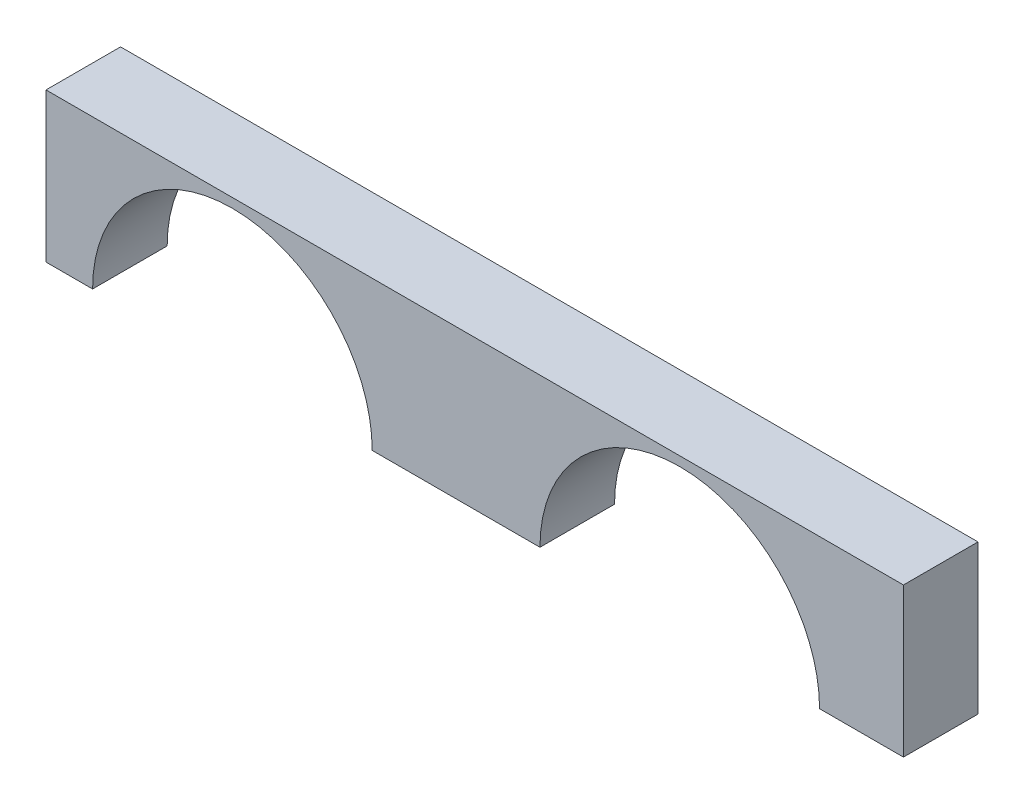
ISO-10303-21;
HEADER;
FILE_DESCRIPTION(('STEP AP214'),'2;1');
FILE_NAME('part.step','',(''),(''),'','','');
FILE_SCHEMA(('AUTOMOTIVE_DESIGN { 1 0 10303 214 1 1 1 1 }'));
ENDSEC;
DATA;
#1=APPLICATION_CONTEXT('core data for automotive mechanical design processes');
#2=APPLICATION_PROTOCOL_DEFINITION('international standard','automotive_design',2000,#1);
#3=PRODUCT_CONTEXT('',#1,'mechanical');
#4=PRODUCT('Part','Part','',(#3));
#5=PRODUCT_RELATED_PRODUCT_CATEGORY('part','',(#4));
#6=PRODUCT_DEFINITION_FORMATION('','',#4);
#7=PRODUCT_DEFINITION_CONTEXT('part definition',#1,'design');
#8=PRODUCT_DEFINITION('design','',#6,#7);
#9=PRODUCT_DEFINITION_SHAPE('','',#8);
#10=(LENGTH_UNIT() NAMED_UNIT(*) SI_UNIT(.MILLI.,.METRE.));
#11=(NAMED_UNIT(*) PLANE_ANGLE_UNIT() SI_UNIT($,.RADIAN.));
#12=(NAMED_UNIT(*) SI_UNIT($,.STERADIAN.) SOLID_ANGLE_UNIT());
#13=UNCERTAINTY_MEASURE_WITH_UNIT(LENGTH_MEASURE(1.E-05),#10,'distance_accuracy_value','');
#14=(GEOMETRIC_REPRESENTATION_CONTEXT(3) GLOBAL_UNCERTAINTY_ASSIGNED_CONTEXT((#13)) GLOBAL_UNIT_ASSIGNED_CONTEXT((#10,
#11,#12)) REPRESENTATION_CONTEXT('',''));
#15=CARTESIAN_POINT('',(0.,0.,0.));
#16=DIRECTION('',(0.,0.,1.));
#17=DIRECTION('',(1.,0.,0.));
#18=AXIS2_PLACEMENT_3D('',#15,#16,#17);
#19=CARTESIAN_POINT('',(0.,0.,20.));
#20=DIRECTION('',(0.,1.,0.));
#21=DIRECTION('',(0.,0.,1.));
#22=AXIS2_PLACEMENT_3D('',#19,#20,#21);
#23=PLANE('',#22);
#24=DIRECTION('',(1.,0.,0.));
#25=VECTOR('',#24,1.);
#26=CARTESIAN_POINT('',(0.,0.,0.));
#27=LINE('',#26,#25);
#28=CARTESIAN_POINT('',(87.5,0.,0.));
#29=VERTEX_POINT('',#28);
#30=CARTESIAN_POINT('',(132.5,0.,0.));
#31=VERTEX_POINT('',#30);
#32=EDGE_CURVE('E120',#29,#31,#27,.T.);
#33=ORIENTED_EDGE('',*,*,#32,.T.);
#34=DIRECTION('',(0.,0.,1.));
#35=VECTOR('',#34,1.);
#36=CARTESIAN_POINT('',(132.5,0.,0.));
#37=LINE('',#36,#35);
#38=CARTESIAN_POINT('',(132.5,0.,20.));
#39=VERTEX_POINT('',#38);
#40=EDGE_CURVE('E50',#31,#39,#37,.T.);
#41=ORIENTED_EDGE('',*,*,#40,.T.);
#42=DIRECTION('',(1.,0.,0.));
#43=VECTOR('',#42,1.);
#44=CARTESIAN_POINT('',(0.,0.,20.));
#45=LINE('',#44,#43);
#46=CARTESIAN_POINT('',(87.5,0.,20.));
#47=VERTEX_POINT('',#46);
#48=EDGE_CURVE('E150',#47,#39,#45,.T.);
#49=ORIENTED_EDGE('',*,*,#48,.F.);
#50=DIRECTION('',(0.,0.,1.));
#51=VECTOR('',#50,1.);
#52=CARTESIAN_POINT('',(87.5,0.,0.));
#53=LINE('',#52,#51);
#54=EDGE_CURVE('E156',#47,#29,#53,.F.);
#55=ORIENTED_EDGE('',*,*,#54,.T.);
#56=EDGE_LOOP('',(#33,#41,#49,#55));
#57=FACE_BOUND('',#56,.T.);
#58=ADVANCED_FACE('F35',(#57),#23,.F.);
#59=CARTESIAN_POINT('',(0.,0.,0.));
#60=VERTEX_POINT('',#59);
#61=CARTESIAN_POINT('',(12.5,0.,0.));
#62=VERTEX_POINT('',#61);
#63=EDGE_CURVE('E123',#60,#62,#27,.T.);
#64=ORIENTED_EDGE('',*,*,#63,.T.);
#65=DIRECTION('',(0.,0.,1.));
#66=VECTOR('',#65,1.);
#67=CARTESIAN_POINT('',(12.5,0.,0.));
#68=LINE('',#67,#66);
#69=CARTESIAN_POINT('',(12.5,0.,20.));
#70=VERTEX_POINT('',#69);
#71=EDGE_CURVE('E58',#62,#70,#68,.T.);
#72=ORIENTED_EDGE('',*,*,#71,.T.);
#73=CARTESIAN_POINT('',(0.,0.,20.));
#74=VERTEX_POINT('',#73);
#75=EDGE_CURVE('E146',#74,#70,#45,.T.);
#76=ORIENTED_EDGE('',*,*,#75,.F.);
#77=DIRECTION('',(0.,0.,-1.));
#78=VECTOR('',#77,1.);
#79=CARTESIAN_POINT('',(0.,0.,20.));
#80=LINE('',#79,#78);
#81=EDGE_CURVE('E11',#74,#60,#80,.T.);
#82=ORIENTED_EDGE('',*,*,#81,.T.);
#83=EDGE_LOOP('',(#64,#72,#76,#82));
#84=FACE_BOUND('',#83,.T.);
#85=ADVANCED_FACE('F170',(#84),#23,.F.);
#86=CARTESIAN_POINT('',(0.,0.,20.));
#87=DIRECTION('',(1.,0.,0.));
#88=DIRECTION('',(0.,0.,-1.));
#89=AXIS2_PLACEMENT_3D('',#86,#87,#88);
#90=PLANE('',#89);
#91=DIRECTION('',(0.,-1.,0.));
#92=VECTOR('',#91,1.);
#93=CARTESIAN_POINT('',(0.,0.,0.));
#94=LINE('',#93,#92);
#95=CARTESIAN_POINT('',(0.,40.,0.));
#96=VERTEX_POINT('',#95);
#97=EDGE_CURVE('E121',#96,#60,#94,.T.);
#98=ORIENTED_EDGE('',*,*,#97,.T.);
#99=ORIENTED_EDGE('',*,*,#81,.F.);
#100=DIRECTION('',(0.,-1.,0.));
#101=VECTOR('',#100,1.);
#102=CARTESIAN_POINT('',(0.,0.,20.));
#103=LINE('',#102,#101);
#104=CARTESIAN_POINT('',(0.,40.,20.));
#105=VERTEX_POINT('',#104);
#106=EDGE_CURVE('E133',#105,#74,#103,.T.);
#107=ORIENTED_EDGE('',*,*,#106,.F.);
#108=DIRECTION('',(0.,0.,-1.));
#109=VECTOR('',#108,1.);
#110=CARTESIAN_POINT('',(0.,40.,20.));
#111=LINE('',#110,#109);
#112=EDGE_CURVE('E136',#105,#96,#111,.T.);
#113=ORIENTED_EDGE('',*,*,#112,.T.);
#114=EDGE_LOOP('',(#98,#99,#107,#113));
#115=FACE_BOUND('',#114,.T.);
#116=ADVANCED_FACE('F37',(#115),#90,.F.);
#117=CARTESIAN_POINT('',(207.5,0.,20.));
#118=VERTEX_POINT('',#117);
#119=CARTESIAN_POINT('',(230.,0.,20.));
#120=VERTEX_POINT('',#119);
#121=EDGE_CURVE('E114',#118,#120,#45,.T.);
#122=ORIENTED_EDGE('',*,*,#121,.F.);
#123=DIRECTION('',(0.,0.,1.));
#124=VECTOR('',#123,1.);
#125=CARTESIAN_POINT('',(207.5,0.,0.));
#126=LINE('',#125,#124);
#127=CARTESIAN_POINT('',(207.5,0.,0.));
#128=VERTEX_POINT('',#127);
#129=EDGE_CURVE('E100',#118,#128,#126,.F.);
#130=ORIENTED_EDGE('',*,*,#129,.T.);
#131=CARTESIAN_POINT('',(230.,0.,0.));
#132=VERTEX_POINT('',#131);
#133=EDGE_CURVE('E112',#128,#132,#27,.T.);
#134=ORIENTED_EDGE('',*,*,#133,.T.);
#135=DIRECTION('',(0.,0.,-1.));
#136=VECTOR('',#135,1.);
#137=CARTESIAN_POINT('',(230.,0.,20.));
#138=LINE('',#137,#136);
#139=EDGE_CURVE('E43',#120,#132,#138,.T.);
#140=ORIENTED_EDGE('',*,*,#139,.F.);
#141=EDGE_LOOP('',(#122,#130,#134,#140));
#142=FACE_BOUND('',#141,.T.);
#143=ADVANCED_FACE('F110',(#142),#23,.F.);
#144=CARTESIAN_POINT('',(230.,0.,20.));
#145=DIRECTION('',(-1.,0.,0.));
#146=DIRECTION('',(0.,0.,1.));
#147=AXIS2_PLACEMENT_3D('',#144,#145,#146);
#148=PLANE('',#147);
#149=DIRECTION('',(0.,1.,0.));
#150=VECTOR('',#149,1.);
#151=CARTESIAN_POINT('',(230.,0.,0.));
#152=LINE('',#151,#150);
#153=CARTESIAN_POINT('',(230.,40.,0.));
#154=VERTEX_POINT('',#153);
#155=EDGE_CURVE('E119',#132,#154,#152,.T.);
#156=ORIENTED_EDGE('',*,*,#155,.T.);
#157=DIRECTION('',(0.,0.,-1.));
#158=VECTOR('',#157,1.);
#159=CARTESIAN_POINT('',(230.,40.,20.));
#160=LINE('',#159,#158);
#161=CARTESIAN_POINT('',(230.,40.,20.));
#162=VERTEX_POINT('',#161);
#163=EDGE_CURVE('E139',#162,#154,#160,.T.);
#164=ORIENTED_EDGE('',*,*,#163,.F.);
#165=DIRECTION('',(0.,1.,0.));
#166=VECTOR('',#165,1.);
#167=CARTESIAN_POINT('',(230.,0.,20.));
#168=LINE('',#167,#166);
#169=EDGE_CURVE('E143',#120,#162,#168,.T.);
#170=ORIENTED_EDGE('',*,*,#169,.F.);
#171=ORIENTED_EDGE('',*,*,#139,.T.);
#172=EDGE_LOOP('',(#156,#164,#170,#171));
#173=FACE_BOUND('',#172,.T.);
#174=ADVANCED_FACE('F142',(#173),#148,.F.);
#175=CARTESIAN_POINT('',(0.,40.,20.));
#176=DIRECTION('',(0.,-1.,0.));
#177=DIRECTION('',(0.,0.,-1.));
#178=AXIS2_PLACEMENT_3D('',#175,#176,#177);
#179=PLANE('',#178);
#180=DIRECTION('',(-1.,0.,0.));
#181=VECTOR('',#180,1.);
#182=CARTESIAN_POINT('',(0.,40.,0.));
#183=LINE('',#182,#181);
#184=EDGE_CURVE('E129',#154,#96,#183,.T.);
#185=ORIENTED_EDGE('',*,*,#184,.T.);
#186=ORIENTED_EDGE('',*,*,#112,.F.);
#187=DIRECTION('',(-1.,0.,0.));
#188=VECTOR('',#187,1.);
#189=CARTESIAN_POINT('',(0.,40.,20.));
#190=LINE('',#189,#188);
#191=EDGE_CURVE('E140',#162,#105,#190,.T.);
#192=ORIENTED_EDGE('',*,*,#191,.F.);
#193=ORIENTED_EDGE('',*,*,#163,.T.);
#194=EDGE_LOOP('',(#185,#186,#192,#193));
#195=FACE_BOUND('',#194,.T.);
#196=ADVANCED_FACE('F177',(#195),#179,.F.);
#197=CARTESIAN_POINT('',(0.,0.,20.));
#198=DIRECTION('',(0.,0.,-1.));
#199=DIRECTION('',(-1.,0.,0.));
#200=AXIS2_PLACEMENT_3D('',#197,#198,#199);
#201=PLANE('',#200);
#202=ORIENTED_EDGE('',*,*,#48,.T.);
#203=CARTESIAN_POINT('',(170.,0.,20.));
#204=DIRECTION('',(0.,0.,1.));
#205=DIRECTION('',(1.,0.,0.));
#206=AXIS2_PLACEMENT_3D('',#203,#204,#205);
#207=CIRCLE('',#206,37.5);
#208=EDGE_CURVE('E106',#118,#39,#207,.T.);
#209=ORIENTED_EDGE('',*,*,#208,.F.);
#210=ORIENTED_EDGE('',*,*,#121,.T.);
#211=ORIENTED_EDGE('',*,*,#169,.T.);
#212=ORIENTED_EDGE('',*,*,#191,.T.);
#213=ORIENTED_EDGE('',*,*,#106,.T.);
#214=ORIENTED_EDGE('',*,*,#75,.T.);
#215=CARTESIAN_POINT('',(50.,0.,20.));
#216=DIRECTION('',(0.,0.,1.));
#217=DIRECTION('',(1.,0.,0.));
#218=AXIS2_PLACEMENT_3D('',#215,#216,#217);
#219=CIRCLE('',#218,37.5);
#220=EDGE_CURVE('E160',#47,#70,#219,.T.);
#221=ORIENTED_EDGE('',*,*,#220,.F.);
#222=EDGE_LOOP('',(#202,#209,#210,#211,#212,#213,#214,#221));
#223=FACE_BOUND('',#222,.T.);
#224=ADVANCED_FACE('F168',(#223),#201,.F.);
#225=CARTESIAN_POINT('',(0.,0.,0.));
#226=DIRECTION('',(0.,0.,-1.));
#227=DIRECTION('',(-1.,0.,0.));
#228=AXIS2_PLACEMENT_3D('',#225,#226,#227);
#229=PLANE('',#228);
#230=CARTESIAN_POINT('',(170.,0.,0.));
#231=DIRECTION('',(0.,0.,1.));
#232=DIRECTION('',(1.,0.,0.));
#233=AXIS2_PLACEMENT_3D('',#230,#231,#232);
#234=CIRCLE('',#233,37.5);
#235=EDGE_CURVE('E97',#128,#31,#234,.T.);
#236=ORIENTED_EDGE('',*,*,#235,.T.);
#237=ORIENTED_EDGE('',*,*,#32,.F.);
#238=CARTESIAN_POINT('',(50.,0.,0.));
#239=DIRECTION('',(0.,0.,1.));
#240=DIRECTION('',(1.,0.,0.));
#241=AXIS2_PLACEMENT_3D('',#238,#239,#240);
#242=CIRCLE('',#241,37.5);
#243=EDGE_CURVE('E159',#29,#62,#242,.T.);
#244=ORIENTED_EDGE('',*,*,#243,.T.);
#245=ORIENTED_EDGE('',*,*,#63,.F.);
#246=ORIENTED_EDGE('',*,*,#97,.F.);
#247=ORIENTED_EDGE('',*,*,#184,.F.);
#248=ORIENTED_EDGE('',*,*,#155,.F.);
#249=ORIENTED_EDGE('',*,*,#133,.F.);
#250=EDGE_LOOP('',(#236,#237,#244,#245,#246,#247,#248,#249));
#251=FACE_BOUND('',#250,.T.);
#252=ADVANCED_FACE('F117',(#251),#229,.T.);
#253=CARTESIAN_POINT('',(50.,0.,0.));
#254=DIRECTION('',(0.,0.,1.));
#255=DIRECTION('',(1.,0.,0.));
#256=AXIS2_PLACEMENT_3D('',#253,#254,#255);
#257=CYLINDRICAL_SURFACE('',#256,37.5);
#258=ORIENTED_EDGE('',*,*,#243,.F.);
#259=ORIENTED_EDGE('',*,*,#54,.F.);
#260=ORIENTED_EDGE('',*,*,#220,.T.);
#261=ORIENTED_EDGE('',*,*,#71,.F.);
#262=EDGE_LOOP('',(#258,#259,#260,#261));
#263=FACE_BOUND('',#262,.T.);
#264=ADVANCED_FACE('F169',(#263),#257,.F.);
#265=CARTESIAN_POINT('',(170.,0.,0.));
#266=DIRECTION('',(0.,0.,1.));
#267=DIRECTION('',(1.,0.,0.));
#268=AXIS2_PLACEMENT_3D('',#265,#266,#267);
#269=CYLINDRICAL_SURFACE('',#268,37.5);
#270=ORIENTED_EDGE('',*,*,#235,.F.);
#271=ORIENTED_EDGE('',*,*,#129,.F.);
#272=ORIENTED_EDGE('',*,*,#208,.T.);
#273=ORIENTED_EDGE('',*,*,#40,.F.);
#274=EDGE_LOOP('',(#270,#271,#272,#273));
#275=FACE_BOUND('',#274,.T.);
#276=ADVANCED_FACE('F99',(#275),#269,.F.);
#277=CLOSED_SHELL('',(#58,#85,#116,#143,#174,#196,#224,#252,#264,#276));
#278=MANIFOLD_SOLID_BREP('B2',#277);
#279=ADVANCED_BREP_SHAPE_REPRESENTATION('',(#18,#278),#14);
#280=SHAPE_DEFINITION_REPRESENTATION(#9,#279);
ENDSEC;
END-ISO-10303-21;
